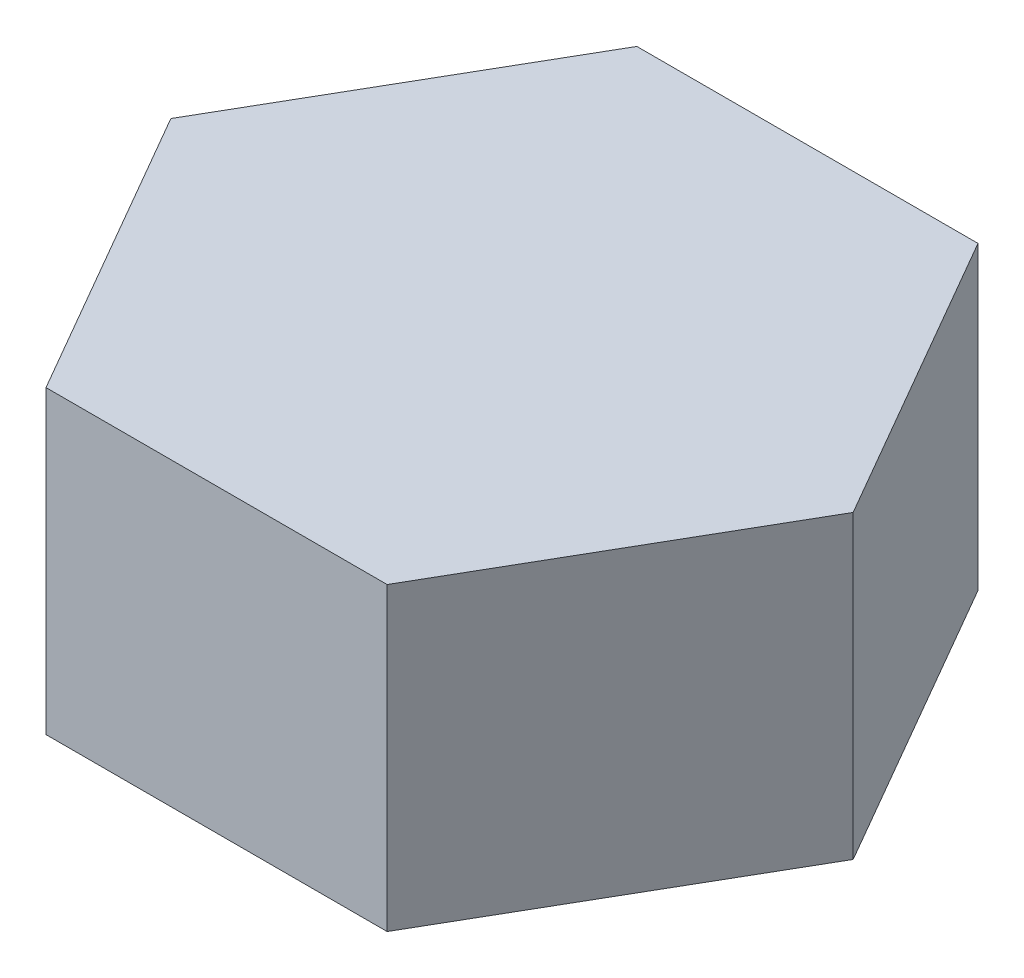
ISO-10303-21;
HEADER;
FILE_DESCRIPTION(('STEP AP214'),'2;1');
FILE_NAME('part.step','',(''),(''),'','','');
FILE_SCHEMA(('AUTOMOTIVE_DESIGN { 1 0 10303 214 1 1 1 1 }'));
ENDSEC;
DATA;
#1=APPLICATION_CONTEXT('core data for automotive mechanical design processes');
#2=APPLICATION_PROTOCOL_DEFINITION('international standard','automotive_design',2000,#1);
#3=PRODUCT_CONTEXT('',#1,'mechanical');
#4=PRODUCT('Part','Part','',(#3));
#5=PRODUCT_RELATED_PRODUCT_CATEGORY('part','',(#4));
#6=PRODUCT_DEFINITION_FORMATION('','',#4);
#7=PRODUCT_DEFINITION_CONTEXT('part definition',#1,'design');
#8=PRODUCT_DEFINITION('design','',#6,#7);
#9=PRODUCT_DEFINITION_SHAPE('','',#8);
#10=(LENGTH_UNIT() NAMED_UNIT(*) SI_UNIT(.MILLI.,.METRE.));
#11=(NAMED_UNIT(*) PLANE_ANGLE_UNIT() SI_UNIT($,.RADIAN.));
#12=(NAMED_UNIT(*) SI_UNIT($,.STERADIAN.) SOLID_ANGLE_UNIT());
#13=UNCERTAINTY_MEASURE_WITH_UNIT(LENGTH_MEASURE(1.E-05),#10,'distance_accuracy_value','');
#14=(GEOMETRIC_REPRESENTATION_CONTEXT(3) GLOBAL_UNCERTAINTY_ASSIGNED_CONTEXT((#13)) GLOBAL_UNIT_ASSIGNED_CONTEXT((#10,
#11,#12)) REPRESENTATION_CONTEXT('',''));
#15=CARTESIAN_POINT('',(0.,0.,0.));
#16=DIRECTION('',(0.,0.,1.));
#17=DIRECTION('',(1.,0.,0.));
#18=AXIS2_PLACEMENT_3D('',#15,#16,#17);
#19=CARTESIAN_POINT('',(3.17857303951003,5.6007,5.50545));
#20=DIRECTION('',(0.,0.,-1.));
#21=DIRECTION('',(-1.,0.,0.));
#22=AXIS2_PLACEMENT_3D('',#19,#20,#21);
#23=PLANE('',#22);
#24=DIRECTION('',(1.,0.,0.));
#25=VECTOR('',#24,1.);
#26=CARTESIAN_POINT('',(3.17857303951003,0.,5.50545));
#27=LINE('',#26,#25);
#28=CARTESIAN_POINT('',(-3.17857303951002,0.,5.50545));
#29=VERTEX_POINT('',#28);
#30=CARTESIAN_POINT('',(3.17857303951003,0.,5.50545));
#31=VERTEX_POINT('',#30);
#32=EDGE_CURVE('E123',#29,#31,#27,.T.);
#33=ORIENTED_EDGE('',*,*,#32,.T.);
#34=DIRECTION('',(0.,-1.,0.));
#35=VECTOR('',#34,1.);
#36=CARTESIAN_POINT('',(3.17857303951003,5.6007,5.50545));
#37=LINE('',#36,#35);
#38=CARTESIAN_POINT('',(3.17857303951003,5.6007,5.50545));
#39=VERTEX_POINT('',#38);
#40=EDGE_CURVE('E11',#39,#31,#37,.T.);
#41=ORIENTED_EDGE('',*,*,#40,.F.);
#42=DIRECTION('',(1.,0.,0.));
#43=VECTOR('',#42,1.);
#44=CARTESIAN_POINT('',(3.17857303951003,5.6007,5.50545));
#45=LINE('',#44,#43);
#46=CARTESIAN_POINT('',(-3.17857303951002,5.6007,5.50545));
#47=VERTEX_POINT('',#46);
#48=EDGE_CURVE('E133',#47,#39,#45,.T.);
#49=ORIENTED_EDGE('',*,*,#48,.F.);
#50=DIRECTION('',(0.,-1.,0.));
#51=VECTOR('',#50,1.);
#52=CARTESIAN_POINT('',(-3.17857303951002,5.6007,5.50545));
#53=LINE('',#52,#51);
#54=EDGE_CURVE('E119',#47,#29,#53,.T.);
#55=ORIENTED_EDGE('',*,*,#54,.T.);
#56=EDGE_LOOP('',(#33,#41,#49,#55));
#57=FACE_BOUND('',#56,.T.);
#58=ADVANCED_FACE('F39',(#57),#23,.F.);
#59=CARTESIAN_POINT('',(6.35714607902005,5.6007,0.));
#60=DIRECTION('',(-0.866025403784438,0.,-0.5));
#61=DIRECTION('',(-0.5,0.,0.866025403784439));
#62=AXIS2_PLACEMENT_3D('',#59,#60,#61);
#63=PLANE('',#62);
#64=DIRECTION('',(0.5,0.,-0.866025403784438));
#65=VECTOR('',#64,1.);
#66=CARTESIAN_POINT('',(6.35714607902005,0.,0.));
#67=LINE('',#66,#65);
#68=CARTESIAN_POINT('',(6.35714607902005,0.,0.));
#69=VERTEX_POINT('',#68);
#70=EDGE_CURVE('E126',#31,#69,#67,.T.);
#71=ORIENTED_EDGE('',*,*,#70,.T.);
#72=DIRECTION('',(0.,-1.,0.));
#73=VECTOR('',#72,1.);
#74=CARTESIAN_POINT('',(6.35714607902005,5.6007,0.));
#75=LINE('',#74,#73);
#76=CARTESIAN_POINT('',(6.35714607902005,5.6007,0.));
#77=VERTEX_POINT('',#76);
#78=EDGE_CURVE('E47',#77,#69,#75,.T.);
#79=ORIENTED_EDGE('',*,*,#78,.F.);
#80=DIRECTION('',(0.5,0.,-0.866025403784438));
#81=VECTOR('',#80,1.);
#82=CARTESIAN_POINT('',(6.35714607902005,5.6007,0.));
#83=LINE('',#82,#81);
#84=EDGE_CURVE('E92',#39,#77,#83,.T.);
#85=ORIENTED_EDGE('',*,*,#84,.F.);
#86=ORIENTED_EDGE('',*,*,#40,.T.);
#87=EDGE_LOOP('',(#71,#79,#85,#86));
#88=FACE_BOUND('',#87,.T.);
#89=ADVANCED_FACE('F157',(#88),#63,.F.);
#90=CARTESIAN_POINT('',(3.17857303951002,5.6007,-5.50545));
#91=DIRECTION('',(-0.866025403784438,0.,0.5));
#92=DIRECTION('',(0.5,0.,0.866025403784439));
#93=AXIS2_PLACEMENT_3D('',#90,#91,#92);
#94=PLANE('',#93);
#95=DIRECTION('',(-0.5,0.,-0.866025403784438));
#96=VECTOR('',#95,1.);
#97=CARTESIAN_POINT('',(3.17857303951002,0.,-5.50545));
#98=LINE('',#97,#96);
#99=CARTESIAN_POINT('',(3.17857303951002,0.,-5.50545));
#100=VERTEX_POINT('',#99);
#101=EDGE_CURVE('E128',#69,#100,#98,.T.);
#102=ORIENTED_EDGE('',*,*,#101,.T.);
#103=DIRECTION('',(0.,-1.,0.));
#104=VECTOR('',#103,1.);
#105=CARTESIAN_POINT('',(3.17857303951002,5.6007,-5.50545));
#106=LINE('',#105,#104);
#107=CARTESIAN_POINT('',(3.17857303951002,5.6007,-5.50545));
#108=VERTEX_POINT('',#107);
#109=EDGE_CURVE('E114',#108,#100,#106,.T.);
#110=ORIENTED_EDGE('',*,*,#109,.F.);
#111=DIRECTION('',(-0.5,0.,-0.866025403784438));
#112=VECTOR('',#111,1.);
#113=CARTESIAN_POINT('',(3.17857303951002,5.6007,-5.50545));
#114=LINE('',#113,#112);
#115=EDGE_CURVE('E105',#77,#108,#114,.T.);
#116=ORIENTED_EDGE('',*,*,#115,.F.);
#117=ORIENTED_EDGE('',*,*,#78,.T.);
#118=EDGE_LOOP('',(#102,#110,#116,#117));
#119=FACE_BOUND('',#118,.T.);
#120=ADVANCED_FACE('F139',(#119),#94,.F.);
#121=CARTESIAN_POINT('',(-3.17857303951003,5.6007,-5.50545));
#122=DIRECTION('',(0.,0.,1.));
#123=DIRECTION('',(1.,0.,0.));
#124=AXIS2_PLACEMENT_3D('',#121,#122,#123);
#125=PLANE('',#124);
#126=DIRECTION('',(-1.,0.,0.));
#127=VECTOR('',#126,1.);
#128=CARTESIAN_POINT('',(-3.17857303951003,0.,-5.50545));
#129=LINE('',#128,#127);
#130=CARTESIAN_POINT('',(-3.17857303951003,0.,-5.50545));
#131=VERTEX_POINT('',#130);
#132=EDGE_CURVE('E113',#100,#131,#129,.T.);
#133=ORIENTED_EDGE('',*,*,#132,.T.);
#134=DIRECTION('',(0.,-1.,0.));
#135=VECTOR('',#134,1.);
#136=CARTESIAN_POINT('',(-3.17857303951003,5.6007,-5.50545));
#137=LINE('',#136,#135);
#138=CARTESIAN_POINT('',(-3.17857303951003,5.6007,-5.50545));
#139=VERTEX_POINT('',#138);
#140=EDGE_CURVE('E110',#139,#131,#137,.T.);
#141=ORIENTED_EDGE('',*,*,#140,.F.);
#142=DIRECTION('',(-1.,0.,0.));
#143=VECTOR('',#142,1.);
#144=CARTESIAN_POINT('',(-3.17857303951003,5.6007,-5.50545));
#145=LINE('',#144,#143);
#146=EDGE_CURVE('E99',#108,#139,#145,.T.);
#147=ORIENTED_EDGE('',*,*,#146,.F.);
#148=ORIENTED_EDGE('',*,*,#109,.T.);
#149=EDGE_LOOP('',(#133,#141,#147,#148));
#150=FACE_BOUND('',#149,.T.);
#151=ADVANCED_FACE('F111',(#150),#125,.F.);
#152=CARTESIAN_POINT('',(-6.35714607902005,5.6007,0.));
#153=DIRECTION('',(0.866025403784439,0.,0.5));
#154=DIRECTION('',(0.5,0.,-0.866025403784439));
#155=AXIS2_PLACEMENT_3D('',#152,#153,#154);
#156=PLANE('',#155);
#157=DIRECTION('',(-0.5,0.,0.866025403784439));
#158=VECTOR('',#157,1.);
#159=CARTESIAN_POINT('',(-6.35714607902005,0.,0.));
#160=LINE('',#159,#158);
#161=CARTESIAN_POINT('',(-6.35714607902005,0.,0.));
#162=VERTEX_POINT('',#161);
#163=EDGE_CURVE('E78',#131,#162,#160,.T.);
#164=ORIENTED_EDGE('',*,*,#163,.T.);
#165=DIRECTION('',(0.,-1.,0.));
#166=VECTOR('',#165,1.);
#167=CARTESIAN_POINT('',(-6.35714607902005,5.6007,0.));
#168=LINE('',#167,#166);
#169=CARTESIAN_POINT('',(-6.35714607902005,5.6007,0.));
#170=VERTEX_POINT('',#169);
#171=EDGE_CURVE('E115',#170,#162,#168,.T.);
#172=ORIENTED_EDGE('',*,*,#171,.F.);
#173=DIRECTION('',(-0.5,0.,0.866025403784439));
#174=VECTOR('',#173,1.);
#175=CARTESIAN_POINT('',(-6.35714607902005,5.6007,0.));
#176=LINE('',#175,#174);
#177=EDGE_CURVE('E103',#139,#170,#176,.T.);
#178=ORIENTED_EDGE('',*,*,#177,.F.);
#179=ORIENTED_EDGE('',*,*,#140,.T.);
#180=EDGE_LOOP('',(#164,#172,#178,#179));
#181=FACE_BOUND('',#180,.T.);
#182=ADVANCED_FACE('F117',(#181),#156,.F.);
#183=CARTESIAN_POINT('',(-3.17857303951002,5.6007,5.50545));
#184=DIRECTION('',(0.866025403784438,0.,-0.5));
#185=DIRECTION('',(-0.5,0.,-0.866025403784438));
#186=AXIS2_PLACEMENT_3D('',#183,#184,#185);
#187=PLANE('',#186);
#188=DIRECTION('',(0.5,0.,0.866025403784438));
#189=VECTOR('',#188,1.);
#190=CARTESIAN_POINT('',(-3.17857303951002,0.,5.50545));
#191=LINE('',#190,#189);
#192=EDGE_CURVE('E84',#162,#29,#191,.T.);
#193=ORIENTED_EDGE('',*,*,#192,.T.);
#194=ORIENTED_EDGE('',*,*,#54,.F.);
#195=DIRECTION('',(0.5,0.,0.866025403784438));
#196=VECTOR('',#195,1.);
#197=CARTESIAN_POINT('',(-3.17857303951002,5.6007,5.50545));
#198=LINE('',#197,#196);
#199=EDGE_CURVE('E55',#170,#47,#198,.T.);
#200=ORIENTED_EDGE('',*,*,#199,.F.);
#201=ORIENTED_EDGE('',*,*,#171,.T.);
#202=EDGE_LOOP('',(#193,#194,#200,#201));
#203=FACE_BOUND('',#202,.T.);
#204=ADVANCED_FACE('F146',(#203),#187,.F.);
#205=CARTESIAN_POINT('',(0.,5.6007,0.));
#206=DIRECTION('',(0.,-1.,0.));
#207=DIRECTION('',(0.,0.,-1.));
#208=AXIS2_PLACEMENT_3D('',#205,#206,#207);
#209=PLANE('',#208);
#210=ORIENTED_EDGE('',*,*,#48,.T.);
#211=ORIENTED_EDGE('',*,*,#84,.T.);
#212=ORIENTED_EDGE('',*,*,#115,.T.);
#213=ORIENTED_EDGE('',*,*,#146,.T.);
#214=ORIENTED_EDGE('',*,*,#177,.T.);
#215=ORIENTED_EDGE('',*,*,#199,.T.);
#216=EDGE_LOOP('',(#210,#211,#212,#213,#214,#215));
#217=FACE_BOUND('',#216,.T.);
#218=ADVANCED_FACE('F101',(#217),#209,.F.);
#219=CARTESIAN_POINT('',(0.,0.,0.));
#220=DIRECTION('',(0.,-1.,0.));
#221=DIRECTION('',(0.,0.,-1.));
#222=AXIS2_PLACEMENT_3D('',#219,#220,#221);
#223=PLANE('',#222);
#224=ORIENTED_EDGE('',*,*,#32,.F.);
#225=ORIENTED_EDGE('',*,*,#192,.F.);
#226=ORIENTED_EDGE('',*,*,#163,.F.);
#227=ORIENTED_EDGE('',*,*,#132,.F.);
#228=ORIENTED_EDGE('',*,*,#101,.F.);
#229=ORIENTED_EDGE('',*,*,#70,.F.);
#230=EDGE_LOOP('',(#224,#225,#226,#227,#228,#229));
#231=FACE_BOUND('',#230,.T.);
#232=ADVANCED_FACE('F142',(#231),#223,.T.);
#233=CLOSED_SHELL('',(#58,#89,#120,#151,#182,#204,#218,#232));
#234=MANIFOLD_SOLID_BREP('B2',#233);
#235=ADVANCED_BREP_SHAPE_REPRESENTATION('',(#18,#234),#14);
#236=SHAPE_DEFINITION_REPRESENTATION(#9,#235);
ENDSEC;
END-ISO-10303-21;
